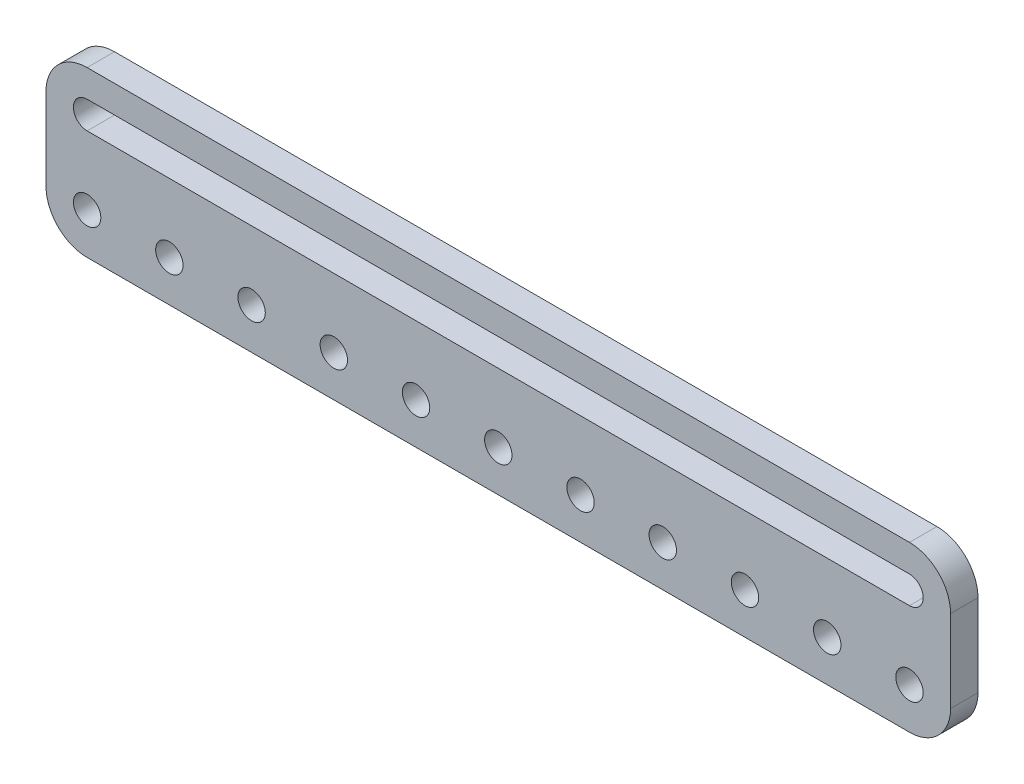
ISO-10303-21;
HEADER;
FILE_DESCRIPTION(('STEP AP214'),'2;1');
FILE_NAME('part.step','',(''),(''),'','','');
FILE_SCHEMA(('AUTOMOTIVE_DESIGN { 1 0 10303 214 1 1 1 1 }'));
ENDSEC;
DATA;
#1=APPLICATION_CONTEXT('core data for automotive mechanical design processes');
#2=APPLICATION_PROTOCOL_DEFINITION('international standard','automotive_design',2000,#1);
#3=PRODUCT_CONTEXT('',#1,'mechanical');
#4=PRODUCT('Part','Part','',(#3));
#5=PRODUCT_RELATED_PRODUCT_CATEGORY('part','',(#4));
#6=PRODUCT_DEFINITION_FORMATION('','',#4);
#7=PRODUCT_DEFINITION_CONTEXT('part definition',#1,'design');
#8=PRODUCT_DEFINITION('design','',#6,#7);
#9=PRODUCT_DEFINITION_SHAPE('','',#8);
#10=(LENGTH_UNIT() NAMED_UNIT(*) SI_UNIT(.MILLI.,.METRE.));
#11=(NAMED_UNIT(*) PLANE_ANGLE_UNIT() SI_UNIT($,.RADIAN.));
#12=(NAMED_UNIT(*) SI_UNIT($,.STERADIAN.) SOLID_ANGLE_UNIT());
#13=UNCERTAINTY_MEASURE_WITH_UNIT(LENGTH_MEASURE(1.E-05),#10,'distance_accuracy_value','');
#14=(GEOMETRIC_REPRESENTATION_CONTEXT(3) GLOBAL_UNCERTAINTY_ASSIGNED_CONTEXT((#13)) GLOBAL_UNIT_ASSIGNED_CONTEXT((#10,
#11,#12)) REPRESENTATION_CONTEXT('',''));
#15=CARTESIAN_POINT('',(0.,0.,0.));
#16=DIRECTION('',(0.,0.,1.));
#17=DIRECTION('',(1.,0.,0.));
#18=AXIS2_PLACEMENT_3D('',#15,#16,#17);
#19=CARTESIAN_POINT('',(346.4291313108,224.2422436139,3.));
#20=DIRECTION('',(0.,0.,1.));
#21=DIRECTION('',(1.,0.,0.));
#22=AXIS2_PLACEMENT_3D('',#19,#20,#21);
#23=PLANE('',#22);
#24=CARTESIAN_POINT('',(346.4291313108,215.2422436139,3.));
#25=DIRECTION('',(0.,0.,1.));
#26=DIRECTION('',(1.,0.,0.));
#27=AXIS2_PLACEMENT_3D('',#24,#25,#26);
#28=CIRCLE('',#27,1.5);
#29=CARTESIAN_POINT('',(347.9291313108,215.2422436139,3.));
#30=VERTEX_POINT('',#29);
#31=EDGE_CURVE('E158',#30,#30,#28,.T.);
#32=ORIENTED_EDGE('',*,*,#31,.F.);
#33=EDGE_LOOP('',(#32));
#34=FACE_BOUND('',#33,.T.);
#35=CARTESIAN_POINT('',(265.4291313108,215.2422436139,3.));
#36=DIRECTION('',(0.,0.,1.));
#37=DIRECTION('',(1.,0.,0.));
#38=AXIS2_PLACEMENT_3D('',#35,#36,#37);
#39=CIRCLE('',#38,1.5);
#40=CARTESIAN_POINT('',(266.9291313108,215.2422436139,3.));
#41=VERTEX_POINT('',#40);
#42=EDGE_CURVE('E170',#41,#41,#39,.T.);
#43=ORIENTED_EDGE('',*,*,#42,.F.);
#44=EDGE_LOOP('',(#43));
#45=FACE_BOUND('',#44,.T.);
#46=CARTESIAN_POINT('',(274.4291313108,215.2422436139,3.));
#47=DIRECTION('',(0.,0.,1.));
#48=DIRECTION('',(1.,0.,0.));
#49=AXIS2_PLACEMENT_3D('',#46,#47,#48);
#50=CIRCLE('',#49,1.5);
#51=CARTESIAN_POINT('',(275.9291313108,215.2422436139,3.));
#52=VERTEX_POINT('',#51);
#53=EDGE_CURVE('E182',#52,#52,#50,.T.);
#54=ORIENTED_EDGE('',*,*,#53,.F.);
#55=EDGE_LOOP('',(#54));
#56=FACE_BOUND('',#55,.T.);
#57=CARTESIAN_POINT('',(292.4291313108,215.2422436139,3.));
#58=DIRECTION('',(0.,0.,1.));
#59=DIRECTION('',(1.,0.,0.));
#60=AXIS2_PLACEMENT_3D('',#57,#58,#59);
#61=CIRCLE('',#60,1.5);
#62=CARTESIAN_POINT('',(293.9291313108,215.2422436139,3.));
#63=VERTEX_POINT('',#62);
#64=EDGE_CURVE('E194',#63,#63,#61,.T.);
#65=ORIENTED_EDGE('',*,*,#64,.F.);
#66=EDGE_LOOP('',(#65));
#67=FACE_BOUND('',#66,.T.);
#68=CARTESIAN_POINT('',(328.4291313108,215.2422436139,3.));
#69=DIRECTION('',(0.,0.,1.));
#70=DIRECTION('',(1.,0.,0.));
#71=AXIS2_PLACEMENT_3D('',#68,#69,#70);
#72=CIRCLE('',#71,1.5);
#73=CARTESIAN_POINT('',(329.9291313108,215.2422436139,3.));
#74=VERTEX_POINT('',#73);
#75=EDGE_CURVE('E206',#74,#74,#72,.T.);
#76=ORIENTED_EDGE('',*,*,#75,.F.);
#77=EDGE_LOOP('',(#76));
#78=FACE_BOUND('',#77,.T.);
#79=CARTESIAN_POINT('',(337.4291313108,215.2422436139,3.));
#80=DIRECTION('',(0.,0.,1.));
#81=DIRECTION('',(1.,0.,0.));
#82=AXIS2_PLACEMENT_3D('',#79,#80,#81);
#83=CIRCLE('',#82,1.5);
#84=CARTESIAN_POINT('',(338.9291313108,215.2422436139,3.));
#85=VERTEX_POINT('',#84);
#86=EDGE_CURVE('E218',#85,#85,#83,.T.);
#87=ORIENTED_EDGE('',*,*,#86,.F.);
#88=EDGE_LOOP('',(#87));
#89=FACE_BOUND('',#88,.T.);
#90=CARTESIAN_POINT('',(346.4291313108,224.2422436139,3.));
#91=DIRECTION('',(0.,0.,1.));
#92=DIRECTION('',(1.,0.,0.));
#93=AXIS2_PLACEMENT_3D('',#90,#91,#92);
#94=CIRCLE('',#93,4.5);
#95=CARTESIAN_POINT('',(350.9291313108,224.2422436139,3.));
#96=VERTEX_POINT('',#95);
#97=CARTESIAN_POINT('',(346.4291313108,228.7422436139,3.));
#98=VERTEX_POINT('',#97);
#99=EDGE_CURVE('E224',#96,#98,#94,.T.);
#100=ORIENTED_EDGE('',*,*,#99,.T.);
#101=DIRECTION('',(-1.,0.,0.));
#102=VECTOR('',#101,1.);
#103=CARTESIAN_POINT('',(256.4291313108,228.7422436139,3.));
#104=LINE('',#103,#102);
#105=CARTESIAN_POINT('',(256.4291313108,228.7422436139,3.));
#106=VERTEX_POINT('',#105);
#107=EDGE_CURVE('E227',#98,#106,#104,.T.);
#108=ORIENTED_EDGE('',*,*,#107,.T.);
#109=CARTESIAN_POINT('',(256.4291313108,224.2422436139,3.));
#110=DIRECTION('',(0.,0.,1.));
#111=DIRECTION('',(1.,0.,0.));
#112=AXIS2_PLACEMENT_3D('',#109,#110,#111);
#113=CIRCLE('',#112,4.5);
#114=CARTESIAN_POINT('',(251.9291313108,224.2422436139,3.));
#115=VERTEX_POINT('',#114);
#116=EDGE_CURVE('E230',#106,#115,#113,.T.);
#117=ORIENTED_EDGE('',*,*,#116,.T.);
#118=DIRECTION('',(0.,-1.,0.));
#119=VECTOR('',#118,1.);
#120=CARTESIAN_POINT('',(251.9291313108,224.2422436139,3.));
#121=LINE('',#120,#119);
#122=CARTESIAN_POINT('',(251.9291313108,215.2422436139,3.));
#123=VERTEX_POINT('',#122);
#124=EDGE_CURVE('E232',#115,#123,#121,.T.);
#125=ORIENTED_EDGE('',*,*,#124,.T.);
#126=CARTESIAN_POINT('',(256.4291313108,215.2422436139,3.));
#127=DIRECTION('',(0.,0.,1.));
#128=DIRECTION('',(1.,0.,0.));
#129=AXIS2_PLACEMENT_3D('',#126,#127,#128);
#130=CIRCLE('',#129,4.50000000000023);
#131=CARTESIAN_POINT('',(256.4291313108,210.7422436139,3.));
#132=VERTEX_POINT('',#131);
#133=EDGE_CURVE('E234',#123,#132,#130,.T.);
#134=ORIENTED_EDGE('',*,*,#133,.T.);
#135=DIRECTION('',(1.,0.,0.));
#136=VECTOR('',#135,1.);
#137=CARTESIAN_POINT('',(346.4291313108,210.7422436139,3.));
#138=LINE('',#137,#136);
#139=CARTESIAN_POINT('',(346.4291313108,210.7422436139,3.));
#140=VERTEX_POINT('',#139);
#141=EDGE_CURVE('E236',#132,#140,#138,.T.);
#142=ORIENTED_EDGE('',*,*,#141,.T.);
#143=CARTESIAN_POINT('',(346.4291313108,215.2422436139,3.));
#144=DIRECTION('',(0.,0.,1.));
#145=DIRECTION('',(1.,0.,0.));
#146=AXIS2_PLACEMENT_3D('',#143,#144,#145);
#147=CIRCLE('',#146,4.5);
#148=CARTESIAN_POINT('',(350.9291313108,215.2422436139,3.));
#149=VERTEX_POINT('',#148);
#150=EDGE_CURVE('E238',#140,#149,#147,.T.);
#151=ORIENTED_EDGE('',*,*,#150,.T.);
#152=DIRECTION('',(0.,1.,0.));
#153=VECTOR('',#152,1.);
#154=CARTESIAN_POINT('',(350.9291313108,224.2422436139,3.));
#155=LINE('',#154,#153);
#156=EDGE_CURVE('E240',#149,#96,#155,.T.);
#157=ORIENTED_EDGE('',*,*,#156,.T.);
#158=EDGE_LOOP('',(#100,#108,#117,#125,#134,#142,#151,#157));
#159=FACE_BOUND('',#158,.T.);
#160=CARTESIAN_POINT('',(319.4291313108,215.2422436139,3.));
#161=DIRECTION('',(0.,0.,1.));
#162=DIRECTION('',(1.,0.,0.));
#163=AXIS2_PLACEMENT_3D('',#160,#161,#162);
#164=CIRCLE('',#163,1.5);
#165=CARTESIAN_POINT('',(320.9291313108,215.2422436139,3.));
#166=VERTEX_POINT('',#165);
#167=EDGE_CURVE('E212',#166,#166,#164,.T.);
#168=ORIENTED_EDGE('',*,*,#167,.F.);
#169=EDGE_LOOP('',(#168));
#170=FACE_BOUND('',#169,.T.);
#171=CARTESIAN_POINT('',(310.4291313108,215.2422436139,3.));
#172=DIRECTION('',(0.,0.,1.));
#173=DIRECTION('',(1.,0.,0.));
#174=AXIS2_PLACEMENT_3D('',#171,#172,#173);
#175=CIRCLE('',#174,1.5);
#176=CARTESIAN_POINT('',(311.9291313108,215.2422436139,3.));
#177=VERTEX_POINT('',#176);
#178=EDGE_CURVE('E200',#177,#177,#175,.T.);
#179=ORIENTED_EDGE('',*,*,#178,.F.);
#180=EDGE_LOOP('',(#179));
#181=FACE_BOUND('',#180,.T.);
#182=CARTESIAN_POINT('',(301.4291313108,215.2422436139,3.));
#183=DIRECTION('',(0.,0.,1.));
#184=DIRECTION('',(1.,0.,0.));
#185=AXIS2_PLACEMENT_3D('',#182,#183,#184);
#186=CIRCLE('',#185,1.5);
#187=CARTESIAN_POINT('',(302.9291313108,215.2422436139,3.));
#188=VERTEX_POINT('',#187);
#189=EDGE_CURVE('E188',#188,#188,#186,.T.);
#190=ORIENTED_EDGE('',*,*,#189,.F.);
#191=EDGE_LOOP('',(#190));
#192=FACE_BOUND('',#191,.T.);
#193=CARTESIAN_POINT('',(283.4291313108,215.2422436139,3.));
#194=DIRECTION('',(0.,0.,1.));
#195=DIRECTION('',(1.,0.,0.));
#196=AXIS2_PLACEMENT_3D('',#193,#194,#195);
#197=CIRCLE('',#196,1.5);
#198=CARTESIAN_POINT('',(284.9291313108,215.2422436139,3.));
#199=VERTEX_POINT('',#198);
#200=EDGE_CURVE('E176',#199,#199,#197,.T.);
#201=ORIENTED_EDGE('',*,*,#200,.F.);
#202=EDGE_LOOP('',(#201));
#203=FACE_BOUND('',#202,.T.);
#204=CARTESIAN_POINT('',(256.4291313108,215.2422436139,3.));
#205=DIRECTION('',(0.,0.,1.));
#206=DIRECTION('',(1.,0.,0.));
#207=AXIS2_PLACEMENT_3D('',#204,#205,#206);
#208=CIRCLE('',#207,1.49999999999983);
#209=CARTESIAN_POINT('',(257.9291313108,215.2422436139,3.));
#210=VERTEX_POINT('',#209);
#211=EDGE_CURVE('E164',#210,#210,#208,.T.);
#212=ORIENTED_EDGE('',*,*,#211,.F.);
#213=EDGE_LOOP('',(#212));
#214=FACE_BOUND('',#213,.T.);
#215=DIRECTION('',(1.,0.,0.));
#216=VECTOR('',#215,1.);
#217=CARTESIAN_POINT('',(256.4291313108,222.7422436139,3.));
#218=LINE('',#217,#216);
#219=CARTESIAN_POINT('',(256.4291313108,222.7422436139,3.));
#220=VERTEX_POINT('',#219);
#221=CARTESIAN_POINT('',(346.4291313108,222.7422436139,3.));
#222=VERTEX_POINT('',#221);
#223=EDGE_CURVE('E130',#220,#222,#218,.T.);
#224=ORIENTED_EDGE('',*,*,#223,.F.);
#225=CARTESIAN_POINT('',(256.4291313108,224.2422436139,3.));
#226=DIRECTION('',(0.,0.,1.));
#227=DIRECTION('',(1.,0.,0.));
#228=AXIS2_PLACEMENT_3D('',#225,#226,#227);
#229=CIRCLE('',#228,1.5);
#230=CARTESIAN_POINT('',(256.4291313108,225.7422436139,3.));
#231=VERTEX_POINT('',#230);
#232=EDGE_CURVE('E122',#231,#220,#229,.T.);
#233=ORIENTED_EDGE('',*,*,#232,.F.);
#234=DIRECTION('',(-1.,0.,0.));
#235=VECTOR('',#234,1.);
#236=CARTESIAN_POINT('',(256.4291313108,225.7422436139,3.));
#237=LINE('',#236,#235);
#238=CARTESIAN_POINT('',(346.4291313108,225.7422436139,3.));
#239=VERTEX_POINT('',#238);
#240=EDGE_CURVE('E144',#239,#231,#237,.T.);
#241=ORIENTED_EDGE('',*,*,#240,.F.);
#242=CARTESIAN_POINT('',(346.4291313108,224.2422436139,3.));
#243=DIRECTION('',(0.,0.,1.));
#244=DIRECTION('',(1.,0.,0.));
#245=AXIS2_PLACEMENT_3D('',#242,#243,#244);
#246=CIRCLE('',#245,1.5);
#247=EDGE_CURVE('E142',#222,#239,#246,.T.);
#248=ORIENTED_EDGE('',*,*,#247,.F.);
#249=EDGE_LOOP('',(#224,#233,#241,#248));
#250=FACE_BOUND('',#249,.T.);
#251=ADVANCED_FACE('F33',(#34,#45,#56,#67,#78,#89,#159,#170,#181,#192,#203,#214,#250),#23,.T.);
#252=CARTESIAN_POINT('',(346.4291313108,224.2422436139,0.));
#253=DIRECTION('',(0.,0.,1.));
#254=DIRECTION('',(1.,0.,0.));
#255=AXIS2_PLACEMENT_3D('',#252,#253,#254);
#256=PLANE('',#255);
#257=CARTESIAN_POINT('',(346.4291313108,215.2422436139,0.));
#258=DIRECTION('',(0.,0.,1.));
#259=DIRECTION('',(1.,0.,0.));
#260=AXIS2_PLACEMENT_3D('',#257,#258,#259);
#261=CIRCLE('',#260,1.5);
#262=CARTESIAN_POINT('',(347.9291313108,215.2422436139,0.));
#263=VERTEX_POINT('',#262);
#264=EDGE_CURVE('E138',#263,#263,#261,.T.);
#265=ORIENTED_EDGE('',*,*,#264,.T.);
#266=EDGE_LOOP('',(#265));
#267=FACE_BOUND('',#266,.T.);
#268=CARTESIAN_POINT('',(265.4291313108,215.2422436139,0.));
#269=DIRECTION('',(0.,0.,1.));
#270=DIRECTION('',(1.,0.,0.));
#271=AXIS2_PLACEMENT_3D('',#268,#269,#270);
#272=CIRCLE('',#271,1.5);
#273=CARTESIAN_POINT('',(266.9291313108,215.2422436139,0.));
#274=VERTEX_POINT('',#273);
#275=EDGE_CURVE('E167',#274,#274,#272,.T.);
#276=ORIENTED_EDGE('',*,*,#275,.T.);
#277=EDGE_LOOP('',(#276));
#278=FACE_BOUND('',#277,.T.);
#279=CARTESIAN_POINT('',(274.4291313108,215.2422436139,0.));
#280=DIRECTION('',(0.,0.,1.));
#281=DIRECTION('',(1.,0.,0.));
#282=AXIS2_PLACEMENT_3D('',#279,#280,#281);
#283=CIRCLE('',#282,1.5);
#284=CARTESIAN_POINT('',(275.9291313108,215.2422436139,0.));
#285=VERTEX_POINT('',#284);
#286=EDGE_CURVE('E179',#285,#285,#283,.T.);
#287=ORIENTED_EDGE('',*,*,#286,.T.);
#288=EDGE_LOOP('',(#287));
#289=FACE_BOUND('',#288,.T.);
#290=CARTESIAN_POINT('',(292.4291313108,215.2422436139,0.));
#291=DIRECTION('',(0.,0.,1.));
#292=DIRECTION('',(1.,0.,0.));
#293=AXIS2_PLACEMENT_3D('',#290,#291,#292);
#294=CIRCLE('',#293,1.5);
#295=CARTESIAN_POINT('',(293.9291313108,215.2422436139,0.));
#296=VERTEX_POINT('',#295);
#297=EDGE_CURVE('E191',#296,#296,#294,.T.);
#298=ORIENTED_EDGE('',*,*,#297,.T.);
#299=EDGE_LOOP('',(#298));
#300=FACE_BOUND('',#299,.T.);
#301=CARTESIAN_POINT('',(328.4291313108,215.2422436139,0.));
#302=DIRECTION('',(0.,0.,1.));
#303=DIRECTION('',(1.,0.,0.));
#304=AXIS2_PLACEMENT_3D('',#301,#302,#303);
#305=CIRCLE('',#304,1.5);
#306=CARTESIAN_POINT('',(329.9291313108,215.2422436139,0.));
#307=VERTEX_POINT('',#306);
#308=EDGE_CURVE('E203',#307,#307,#305,.T.);
#309=ORIENTED_EDGE('',*,*,#308,.T.);
#310=EDGE_LOOP('',(#309));
#311=FACE_BOUND('',#310,.T.);
#312=CARTESIAN_POINT('',(337.4291313108,215.2422436139,0.));
#313=DIRECTION('',(0.,0.,1.));
#314=DIRECTION('',(1.,0.,0.));
#315=AXIS2_PLACEMENT_3D('',#312,#313,#314);
#316=CIRCLE('',#315,1.5);
#317=CARTESIAN_POINT('',(338.9291313108,215.2422436139,0.));
#318=VERTEX_POINT('',#317);
#319=EDGE_CURVE('E215',#318,#318,#316,.T.);
#320=ORIENTED_EDGE('',*,*,#319,.T.);
#321=EDGE_LOOP('',(#320));
#322=FACE_BOUND('',#321,.T.);
#323=CARTESIAN_POINT('',(346.4291313108,224.2422436139,0.));
#324=DIRECTION('',(0.,0.,1.));
#325=DIRECTION('',(1.,0.,0.));
#326=AXIS2_PLACEMENT_3D('',#323,#324,#325);
#327=CIRCLE('',#326,4.5);
#328=CARTESIAN_POINT('',(350.9291313108,224.2422436139,0.));
#329=VERTEX_POINT('',#328);
#330=CARTESIAN_POINT('',(346.4291313108,228.7422436139,0.));
#331=VERTEX_POINT('',#330);
#332=EDGE_CURVE('E221',#329,#331,#327,.T.);
#333=ORIENTED_EDGE('',*,*,#332,.F.);
#334=DIRECTION('',(0.,1.,0.));
#335=VECTOR('',#334,1.);
#336=CARTESIAN_POINT('',(350.9291313108,224.2422436139,0.));
#337=LINE('',#336,#335);
#338=CARTESIAN_POINT('',(350.9291313108,215.2422436139,0.));
#339=VERTEX_POINT('',#338);
#340=EDGE_CURVE('E228',#339,#329,#337,.T.);
#341=ORIENTED_EDGE('',*,*,#340,.F.);
#342=CARTESIAN_POINT('',(346.4291313108,215.2422436139,0.));
#343=DIRECTION('',(0.,0.,1.));
#344=DIRECTION('',(1.,0.,0.));
#345=AXIS2_PLACEMENT_3D('',#342,#343,#344);
#346=CIRCLE('',#345,4.5);
#347=CARTESIAN_POINT('',(346.4291313108,210.7422436139,0.));
#348=VERTEX_POINT('',#347);
#349=EDGE_CURVE('E255',#348,#339,#346,.T.);
#350=ORIENTED_EDGE('',*,*,#349,.F.);
#351=DIRECTION('',(1.,0.,0.));
#352=VECTOR('',#351,1.);
#353=CARTESIAN_POINT('',(346.4291313108,210.7422436139,0.));
#354=LINE('',#353,#352);
#355=CARTESIAN_POINT('',(256.4291313108,210.7422436139,0.));
#356=VERTEX_POINT('',#355);
#357=EDGE_CURVE('E253',#356,#348,#354,.T.);
#358=ORIENTED_EDGE('',*,*,#357,.F.);
#359=CARTESIAN_POINT('',(256.4291313108,215.2422436139,0.));
#360=DIRECTION('',(0.,0.,1.));
#361=DIRECTION('',(1.,0.,0.));
#362=AXIS2_PLACEMENT_3D('',#359,#360,#361);
#363=CIRCLE('',#362,4.50000000000023);
#364=CARTESIAN_POINT('',(251.9291313108,215.2422436139,0.));
#365=VERTEX_POINT('',#364);
#366=EDGE_CURVE('E251',#365,#356,#363,.T.);
#367=ORIENTED_EDGE('',*,*,#366,.F.);
#368=DIRECTION('',(0.,-1.,0.));
#369=VECTOR('',#368,1.);
#370=CARTESIAN_POINT('',(251.9291313108,224.2422436139,0.));
#371=LINE('',#370,#369);
#372=CARTESIAN_POINT('',(251.9291313108,224.2422436139,0.));
#373=VERTEX_POINT('',#372);
#374=EDGE_CURVE('E249',#373,#365,#371,.T.);
#375=ORIENTED_EDGE('',*,*,#374,.F.);
#376=CARTESIAN_POINT('',(256.4291313108,224.2422436139,0.));
#377=DIRECTION('',(0.,0.,1.));
#378=DIRECTION('',(1.,0.,0.));
#379=AXIS2_PLACEMENT_3D('',#376,#377,#378);
#380=CIRCLE('',#379,4.5);
#381=CARTESIAN_POINT('',(256.4291313108,228.7422436139,0.));
#382=VERTEX_POINT('',#381);
#383=EDGE_CURVE('E247',#382,#373,#380,.T.);
#384=ORIENTED_EDGE('',*,*,#383,.F.);
#385=DIRECTION('',(-1.,0.,0.));
#386=VECTOR('',#385,1.);
#387=CARTESIAN_POINT('',(256.4291313108,228.7422436139,0.));
#388=LINE('',#387,#386);
#389=EDGE_CURVE('E245',#331,#382,#388,.T.);
#390=ORIENTED_EDGE('',*,*,#389,.F.);
#391=EDGE_LOOP('',(#333,#341,#350,#358,#367,#375,#384,#390));
#392=FACE_BOUND('',#391,.T.);
#393=CARTESIAN_POINT('',(319.4291313108,215.2422436139,0.));
#394=DIRECTION('',(0.,0.,1.));
#395=DIRECTION('',(1.,0.,0.));
#396=AXIS2_PLACEMENT_3D('',#393,#394,#395);
#397=CIRCLE('',#396,1.5);
#398=CARTESIAN_POINT('',(320.9291313108,215.2422436139,0.));
#399=VERTEX_POINT('',#398);
#400=EDGE_CURVE('E209',#399,#399,#397,.T.);
#401=ORIENTED_EDGE('',*,*,#400,.T.);
#402=EDGE_LOOP('',(#401));
#403=FACE_BOUND('',#402,.T.);
#404=CARTESIAN_POINT('',(310.4291313108,215.2422436139,0.));
#405=DIRECTION('',(0.,0.,1.));
#406=DIRECTION('',(1.,0.,0.));
#407=AXIS2_PLACEMENT_3D('',#404,#405,#406);
#408=CIRCLE('',#407,1.5);
#409=CARTESIAN_POINT('',(311.9291313108,215.2422436139,0.));
#410=VERTEX_POINT('',#409);
#411=EDGE_CURVE('E197',#410,#410,#408,.T.);
#412=ORIENTED_EDGE('',*,*,#411,.T.);
#413=EDGE_LOOP('',(#412));
#414=FACE_BOUND('',#413,.T.);
#415=CARTESIAN_POINT('',(301.4291313108,215.2422436139,0.));
#416=DIRECTION('',(0.,0.,1.));
#417=DIRECTION('',(1.,0.,0.));
#418=AXIS2_PLACEMENT_3D('',#415,#416,#417);
#419=CIRCLE('',#418,1.5);
#420=CARTESIAN_POINT('',(302.9291313108,215.2422436139,0.));
#421=VERTEX_POINT('',#420);
#422=EDGE_CURVE('E185',#421,#421,#419,.T.);
#423=ORIENTED_EDGE('',*,*,#422,.T.);
#424=EDGE_LOOP('',(#423));
#425=FACE_BOUND('',#424,.T.);
#426=CARTESIAN_POINT('',(283.4291313108,215.2422436139,0.));
#427=DIRECTION('',(0.,0.,1.));
#428=DIRECTION('',(1.,0.,0.));
#429=AXIS2_PLACEMENT_3D('',#426,#427,#428);
#430=CIRCLE('',#429,1.5);
#431=CARTESIAN_POINT('',(284.9291313108,215.2422436139,0.));
#432=VERTEX_POINT('',#431);
#433=EDGE_CURVE('E173',#432,#432,#430,.T.);
#434=ORIENTED_EDGE('',*,*,#433,.T.);
#435=EDGE_LOOP('',(#434));
#436=FACE_BOUND('',#435,.T.);
#437=CARTESIAN_POINT('',(256.4291313108,215.2422436139,0.));
#438=DIRECTION('',(0.,0.,1.));
#439=DIRECTION('',(1.,0.,0.));
#440=AXIS2_PLACEMENT_3D('',#437,#438,#439);
#441=CIRCLE('',#440,1.49999999999983);
#442=CARTESIAN_POINT('',(257.9291313108,215.2422436139,0.));
#443=VERTEX_POINT('',#442);
#444=EDGE_CURVE('E161',#443,#443,#441,.T.);
#445=ORIENTED_EDGE('',*,*,#444,.T.);
#446=EDGE_LOOP('',(#445));
#447=FACE_BOUND('',#446,.T.);
#448=CARTESIAN_POINT('',(256.4291313108,224.2422436139,0.));
#449=DIRECTION('',(0.,0.,1.));
#450=DIRECTION('',(1.,0.,0.));
#451=AXIS2_PLACEMENT_3D('',#448,#449,#450);
#452=CIRCLE('',#451,1.5);
#453=CARTESIAN_POINT('',(256.4291313108,225.7422436139,0.));
#454=VERTEX_POINT('',#453);
#455=CARTESIAN_POINT('',(256.4291313108,222.7422436139,0.));
#456=VERTEX_POINT('',#455);
#457=EDGE_CURVE('E56',#454,#456,#452,.T.);
#458=ORIENTED_EDGE('',*,*,#457,.T.);
#459=DIRECTION('',(1.,0.,0.));
#460=VECTOR('',#459,1.);
#461=CARTESIAN_POINT('',(256.4291313108,222.7422436139,0.));
#462=LINE('',#461,#460);
#463=CARTESIAN_POINT('',(346.4291313108,222.7422436139,0.));
#464=VERTEX_POINT('',#463);
#465=EDGE_CURVE('E137',#456,#464,#462,.T.);
#466=ORIENTED_EDGE('',*,*,#465,.T.);
#467=CARTESIAN_POINT('',(346.4291313108,224.2422436139,0.));
#468=DIRECTION('',(0.,0.,1.));
#469=DIRECTION('',(1.,0.,0.));
#470=AXIS2_PLACEMENT_3D('',#467,#468,#469);
#471=CIRCLE('',#470,1.5);
#472=CARTESIAN_POINT('',(346.4291313108,225.7422436139,0.));
#473=VERTEX_POINT('',#472);
#474=EDGE_CURVE('E150',#464,#473,#471,.T.);
#475=ORIENTED_EDGE('',*,*,#474,.T.);
#476=DIRECTION('',(-1.,0.,0.));
#477=VECTOR('',#476,1.);
#478=CARTESIAN_POINT('',(256.4291313108,225.7422436139,0.));
#479=LINE('',#478,#477);
#480=EDGE_CURVE('E131',#473,#454,#479,.T.);
#481=ORIENTED_EDGE('',*,*,#480,.T.);
#482=EDGE_LOOP('',(#458,#466,#475,#481));
#483=FACE_BOUND('',#482,.T.);
#484=ADVANCED_FACE('F285',(#267,#278,#289,#300,#311,#322,#392,#403,#414,#425,#436,#447,#483),
#256,.F.);
#485=CARTESIAN_POINT('',(346.4291313108,224.2422436139,3.));
#486=DIRECTION('',(0.,0.,-1.));
#487=DIRECTION('',(-1.,0.,0.));
#488=AXIS2_PLACEMENT_3D('',#485,#486,#487);
#489=CYLINDRICAL_SURFACE('',#488,4.5);
#490=ORIENTED_EDGE('',*,*,#332,.T.);
#491=DIRECTION('',(0.,0.,-1.));
#492=VECTOR('',#491,1.);
#493=CARTESIAN_POINT('',(346.4291313108,228.7422436139,3.));
#494=LINE('',#493,#492);
#495=EDGE_CURVE('E11',#98,#331,#494,.T.);
#496=ORIENTED_EDGE('',*,*,#495,.F.);
#497=ORIENTED_EDGE('',*,*,#99,.F.);
#498=DIRECTION('',(0.,0.,-1.));
#499=VECTOR('',#498,1.);
#500=CARTESIAN_POINT('',(350.9291313108,224.2422436139,3.));
#501=LINE('',#500,#499);
#502=EDGE_CURVE('E242',#96,#329,#501,.T.);
#503=ORIENTED_EDGE('',*,*,#502,.T.);
#504=EDGE_LOOP('',(#490,#496,#497,#503));
#505=FACE_BOUND('',#504,.T.);
#506=ADVANCED_FACE('F35',(#505),#489,.T.);
#507=CARTESIAN_POINT('',(256.4291313108,228.7422436139,3.));
#508=DIRECTION('',(0.,-1.,0.));
#509=DIRECTION('',(0.,0.,-1.));
#510=AXIS2_PLACEMENT_3D('',#507,#508,#509);
#511=PLANE('',#510);
#512=ORIENTED_EDGE('',*,*,#389,.T.);
#513=DIRECTION('',(0.,0.,-1.));
#514=VECTOR('',#513,1.);
#515=CARTESIAN_POINT('',(256.4291313108,228.7422436139,3.));
#516=LINE('',#515,#514);
#517=EDGE_CURVE('E41',#106,#382,#516,.T.);
#518=ORIENTED_EDGE('',*,*,#517,.F.);
#519=ORIENTED_EDGE('',*,*,#107,.F.);
#520=ORIENTED_EDGE('',*,*,#495,.T.);
#521=EDGE_LOOP('',(#512,#518,#519,#520));
#522=FACE_BOUND('',#521,.T.);
#523=ADVANCED_FACE('F303',(#522),#511,.F.);
#524=CARTESIAN_POINT('',(256.4291313108,224.2422436139,3.));
#525=DIRECTION('',(0.,0.,-1.));
#526=DIRECTION('',(-1.,0.,0.));
#527=AXIS2_PLACEMENT_3D('',#524,#525,#526);
#528=CYLINDRICAL_SURFACE('',#527,4.5);
#529=ORIENTED_EDGE('',*,*,#383,.T.);
#530=DIRECTION('',(0.,0.,-1.));
#531=VECTOR('',#530,1.);
#532=CARTESIAN_POINT('',(251.9291313108,224.2422436139,3.));
#533=LINE('',#532,#531);
#534=EDGE_CURVE('E272',#115,#373,#533,.T.);
#535=ORIENTED_EDGE('',*,*,#534,.F.);
#536=ORIENTED_EDGE('',*,*,#116,.F.);
#537=ORIENTED_EDGE('',*,*,#517,.T.);
#538=EDGE_LOOP('',(#529,#535,#536,#537));
#539=FACE_BOUND('',#538,.T.);
#540=ADVANCED_FACE('F279',(#539),#528,.T.);
#541=CARTESIAN_POINT('',(251.9291313108,224.2422436139,3.));
#542=DIRECTION('',(1.,0.,0.));
#543=DIRECTION('',(0.,0.,-1.));
#544=AXIS2_PLACEMENT_3D('',#541,#542,#543);
#545=PLANE('',#544);
#546=ORIENTED_EDGE('',*,*,#374,.T.);
#547=DIRECTION('',(0.,0.,-1.));
#548=VECTOR('',#547,1.);
#549=CARTESIAN_POINT('',(251.9291313108,215.2422436139,3.));
#550=LINE('',#549,#548);
#551=EDGE_CURVE('E269',#123,#365,#550,.T.);
#552=ORIENTED_EDGE('',*,*,#551,.F.);
#553=ORIENTED_EDGE('',*,*,#124,.F.);
#554=ORIENTED_EDGE('',*,*,#534,.T.);
#555=EDGE_LOOP('',(#546,#552,#553,#554));
#556=FACE_BOUND('',#555,.T.);
#557=ADVANCED_FACE('F291',(#556),#545,.F.);
#558=CARTESIAN_POINT('',(256.4291313108,215.2422436139,3.));
#559=DIRECTION('',(0.,0.,-1.));
#560=DIRECTION('',(-1.,0.,0.));
#561=AXIS2_PLACEMENT_3D('',#558,#559,#560);
#562=CYLINDRICAL_SURFACE('',#561,4.50000000000023);
#563=ORIENTED_EDGE('',*,*,#366,.T.);
#564=DIRECTION('',(0.,0.,-1.));
#565=VECTOR('',#564,1.);
#566=CARTESIAN_POINT('',(256.4291313108,210.7422436139,3.));
#567=LINE('',#566,#565);
#568=EDGE_CURVE('E266',#132,#356,#567,.T.);
#569=ORIENTED_EDGE('',*,*,#568,.F.);
#570=ORIENTED_EDGE('',*,*,#133,.F.);
#571=ORIENTED_EDGE('',*,*,#551,.T.);
#572=EDGE_LOOP('',(#563,#569,#570,#571));
#573=FACE_BOUND('',#572,.T.);
#574=ADVANCED_FACE('F295',(#573),#562,.T.);
#575=CARTESIAN_POINT('',(346.4291313108,210.7422436139,3.));
#576=DIRECTION('',(0.,1.,0.));
#577=DIRECTION('',(0.,0.,1.));
#578=AXIS2_PLACEMENT_3D('',#575,#576,#577);
#579=PLANE('',#578);
#580=ORIENTED_EDGE('',*,*,#357,.T.);
#581=DIRECTION('',(0.,0.,-1.));
#582=VECTOR('',#581,1.);
#583=CARTESIAN_POINT('',(346.4291313108,210.7422436139,3.));
#584=LINE('',#583,#582);
#585=EDGE_CURVE('E263',#140,#348,#584,.T.);
#586=ORIENTED_EDGE('',*,*,#585,.F.);
#587=ORIENTED_EDGE('',*,*,#141,.F.);
#588=ORIENTED_EDGE('',*,*,#568,.T.);
#589=EDGE_LOOP('',(#580,#586,#587,#588));
#590=FACE_BOUND('',#589,.T.);
#591=ADVANCED_FACE('F316',(#590),#579,.F.);
#592=CARTESIAN_POINT('',(346.4291313108,215.2422436139,3.));
#593=DIRECTION('',(0.,0.,-1.));
#594=DIRECTION('',(-1.,0.,0.));
#595=AXIS2_PLACEMENT_3D('',#592,#593,#594);
#596=CYLINDRICAL_SURFACE('',#595,4.5);
#597=ORIENTED_EDGE('',*,*,#349,.T.);
#598=DIRECTION('',(0.,0.,-1.));
#599=VECTOR('',#598,1.);
#600=CARTESIAN_POINT('',(350.9291313108,215.2422436139,3.));
#601=LINE('',#600,#599);
#602=EDGE_CURVE('E260',#149,#339,#601,.T.);
#603=ORIENTED_EDGE('',*,*,#602,.F.);
#604=ORIENTED_EDGE('',*,*,#150,.F.);
#605=ORIENTED_EDGE('',*,*,#585,.T.);
#606=EDGE_LOOP('',(#597,#603,#604,#605));
#607=FACE_BOUND('',#606,.T.);
#608=ADVANCED_FACE('F314',(#607),#596,.T.);
#609=CARTESIAN_POINT('',(350.9291313108,224.2422436139,3.));
#610=DIRECTION('',(-1.,0.,0.));
#611=DIRECTION('',(0.,0.,1.));
#612=AXIS2_PLACEMENT_3D('',#609,#610,#611);
#613=PLANE('',#612);
#614=ORIENTED_EDGE('',*,*,#340,.T.);
#615=ORIENTED_EDGE('',*,*,#502,.F.);
#616=ORIENTED_EDGE('',*,*,#156,.F.);
#617=ORIENTED_EDGE('',*,*,#602,.T.);
#618=EDGE_LOOP('',(#614,#615,#616,#617));
#619=FACE_BOUND('',#618,.T.);
#620=ADVANCED_FACE('F309',(#619),#613,.F.);
#621=CARTESIAN_POINT('',(337.4291313108,215.2422436139,3.));
#622=DIRECTION('',(0.,0.,-1.));
#623=DIRECTION('',(-1.,0.,0.));
#624=AXIS2_PLACEMENT_3D('',#621,#622,#623);
#625=CYLINDRICAL_SURFACE('',#624,1.5);
#626=ORIENTED_EDGE('',*,*,#86,.T.);
#627=EDGE_LOOP('',(#626));
#628=FACE_BOUND('',#627,.T.);
#629=ORIENTED_EDGE('',*,*,#319,.F.);
#630=EDGE_LOOP('',(#629));
#631=FACE_BOUND('',#630,.T.);
#632=ADVANCED_FACE('F336',(#628,#631),#625,.F.);
#633=CARTESIAN_POINT('',(319.4291313108,215.2422436139,3.));
#634=DIRECTION('',(0.,0.,-1.));
#635=DIRECTION('',(-1.,0.,0.));
#636=AXIS2_PLACEMENT_3D('',#633,#634,#635);
#637=CYLINDRICAL_SURFACE('',#636,1.5);
#638=ORIENTED_EDGE('',*,*,#167,.T.);
#639=EDGE_LOOP('',(#638));
#640=FACE_BOUND('',#639,.T.);
#641=ORIENTED_EDGE('',*,*,#400,.F.);
#642=EDGE_LOOP('',(#641));
#643=FACE_BOUND('',#642,.T.);
#644=ADVANCED_FACE('F343',(#640,#643),#637,.F.);
#645=CARTESIAN_POINT('',(328.4291313108,215.2422436139,3.));
#646=DIRECTION('',(0.,0.,-1.));
#647=DIRECTION('',(-1.,0.,0.));
#648=AXIS2_PLACEMENT_3D('',#645,#646,#647);
#649=CYLINDRICAL_SURFACE('',#648,1.5);
#650=ORIENTED_EDGE('',*,*,#75,.T.);
#651=EDGE_LOOP('',(#650));
#652=FACE_BOUND('',#651,.T.);
#653=ORIENTED_EDGE('',*,*,#308,.F.);
#654=EDGE_LOOP('',(#653));
#655=FACE_BOUND('',#654,.T.);
#656=ADVANCED_FACE('F348',(#652,#655),#649,.F.);
#657=CARTESIAN_POINT('',(310.4291313108,215.2422436139,3.));
#658=DIRECTION('',(0.,0.,-1.));
#659=DIRECTION('',(-1.,0.,0.));
#660=AXIS2_PLACEMENT_3D('',#657,#658,#659);
#661=CYLINDRICAL_SURFACE('',#660,1.5);
#662=ORIENTED_EDGE('',*,*,#178,.T.);
#663=EDGE_LOOP('',(#662));
#664=FACE_BOUND('',#663,.T.);
#665=ORIENTED_EDGE('',*,*,#411,.F.);
#666=EDGE_LOOP('',(#665));
#667=FACE_BOUND('',#666,.T.);
#668=ADVANCED_FACE('F358',(#664,#667),#661,.F.);
#669=CARTESIAN_POINT('',(292.4291313108,215.2422436139,3.));
#670=DIRECTION('',(0.,0.,-1.));
#671=DIRECTION('',(-1.,0.,0.));
#672=AXIS2_PLACEMENT_3D('',#669,#670,#671);
#673=CYLINDRICAL_SURFACE('',#672,1.5);
#674=ORIENTED_EDGE('',*,*,#64,.T.);
#675=EDGE_LOOP('',(#674));
#676=FACE_BOUND('',#675,.T.);
#677=ORIENTED_EDGE('',*,*,#297,.F.);
#678=EDGE_LOOP('',(#677));
#679=FACE_BOUND('',#678,.T.);
#680=ADVANCED_FACE('F365',(#676,#679),#673,.F.);
#681=CARTESIAN_POINT('',(301.4291313108,215.2422436139,3.));
#682=DIRECTION('',(0.,0.,-1.));
#683=DIRECTION('',(-1.,0.,0.));
#684=AXIS2_PLACEMENT_3D('',#681,#682,#683);
#685=CYLINDRICAL_SURFACE('',#684,1.5);
#686=ORIENTED_EDGE('',*,*,#189,.T.);
#687=EDGE_LOOP('',(#686));
#688=FACE_BOUND('',#687,.T.);
#689=ORIENTED_EDGE('',*,*,#422,.F.);
#690=EDGE_LOOP('',(#689));
#691=FACE_BOUND('',#690,.T.);
#692=ADVANCED_FACE('F369',(#688,#691),#685,.F.);
#693=CARTESIAN_POINT('',(274.4291313108,215.2422436139,3.));
#694=DIRECTION('',(0.,0.,-1.));
#695=DIRECTION('',(-1.,0.,0.));
#696=AXIS2_PLACEMENT_3D('',#693,#694,#695);
#697=CYLINDRICAL_SURFACE('',#696,1.5);
#698=ORIENTED_EDGE('',*,*,#53,.T.);
#699=EDGE_LOOP('',(#698));
#700=FACE_BOUND('',#699,.T.);
#701=ORIENTED_EDGE('',*,*,#286,.F.);
#702=EDGE_LOOP('',(#701));
#703=FACE_BOUND('',#702,.T.);
#704=ADVANCED_FACE('F373',(#700,#703),#697,.F.);
#705=CARTESIAN_POINT('',(283.4291313108,215.2422436139,3.));
#706=DIRECTION('',(0.,0.,-1.));
#707=DIRECTION('',(-1.,0.,0.));
#708=AXIS2_PLACEMENT_3D('',#705,#706,#707);
#709=CYLINDRICAL_SURFACE('',#708,1.5);
#710=ORIENTED_EDGE('',*,*,#200,.T.);
#711=EDGE_LOOP('',(#710));
#712=FACE_BOUND('',#711,.T.);
#713=ORIENTED_EDGE('',*,*,#433,.F.);
#714=EDGE_LOOP('',(#713));
#715=FACE_BOUND('',#714,.T.);
#716=ADVANCED_FACE('F377',(#712,#715),#709,.F.);
#717=CARTESIAN_POINT('',(265.4291313108,215.2422436139,3.));
#718=DIRECTION('',(0.,0.,-1.));
#719=DIRECTION('',(-1.,0.,0.));
#720=AXIS2_PLACEMENT_3D('',#717,#718,#719);
#721=CYLINDRICAL_SURFACE('',#720,1.5);
#722=ORIENTED_EDGE('',*,*,#42,.T.);
#723=EDGE_LOOP('',(#722));
#724=FACE_BOUND('',#723,.T.);
#725=ORIENTED_EDGE('',*,*,#275,.F.);
#726=EDGE_LOOP('',(#725));
#727=FACE_BOUND('',#726,.T.);
#728=ADVANCED_FACE('F381',(#724,#727),#721,.F.);
#729=CARTESIAN_POINT('',(256.4291313108,215.2422436139,3.));
#730=DIRECTION('',(0.,0.,-1.));
#731=DIRECTION('',(-1.,0.,0.));
#732=AXIS2_PLACEMENT_3D('',#729,#730,#731);
#733=CYLINDRICAL_SURFACE('',#732,1.49999999999983);
#734=ORIENTED_EDGE('',*,*,#211,.T.);
#735=EDGE_LOOP('',(#734));
#736=FACE_BOUND('',#735,.T.);
#737=ORIENTED_EDGE('',*,*,#444,.F.);
#738=EDGE_LOOP('',(#737));
#739=FACE_BOUND('',#738,.T.);
#740=ADVANCED_FACE('F385',(#736,#739),#733,.F.);
#741=CARTESIAN_POINT('',(346.4291313108,215.2422436139,3.));
#742=DIRECTION('',(0.,0.,-1.));
#743=DIRECTION('',(-1.,0.,0.));
#744=AXIS2_PLACEMENT_3D('',#741,#742,#743);
#745=CYLINDRICAL_SURFACE('',#744,1.5);
#746=ORIENTED_EDGE('',*,*,#31,.T.);
#747=EDGE_LOOP('',(#746));
#748=FACE_BOUND('',#747,.T.);
#749=ORIENTED_EDGE('',*,*,#264,.F.);
#750=EDGE_LOOP('',(#749));
#751=FACE_BOUND('',#750,.T.);
#752=ADVANCED_FACE('F389',(#748,#751),#745,.F.);
#753=CARTESIAN_POINT('',(256.4291313108,224.2422436139,3.));
#754=DIRECTION('',(0.,0.,-1.));
#755=DIRECTION('',(-1.,0.,0.));
#756=AXIS2_PLACEMENT_3D('',#753,#754,#755);
#757=CYLINDRICAL_SURFACE('',#756,1.5);
#758=ORIENTED_EDGE('',*,*,#457,.F.);
#759=DIRECTION('',(0.,0.,-1.));
#760=VECTOR('',#759,1.);
#761=CARTESIAN_POINT('',(256.4291313108,225.7422436139,3.));
#762=LINE('',#761,#760);
#763=EDGE_CURVE('E126',#231,#454,#762,.T.);
#764=ORIENTED_EDGE('',*,*,#763,.F.);
#765=ORIENTED_EDGE('',*,*,#232,.T.);
#766=DIRECTION('',(0.,0.,-1.));
#767=VECTOR('',#766,1.);
#768=CARTESIAN_POINT('',(256.4291313108,222.7422436139,3.));
#769=LINE('',#768,#767);
#770=EDGE_CURVE('E125',#220,#456,#769,.T.);
#771=ORIENTED_EDGE('',*,*,#770,.T.);
#772=EDGE_LOOP('',(#758,#764,#765,#771));
#773=FACE_BOUND('',#772,.T.);
#774=ADVANCED_FACE('F124',(#773),#757,.F.);
#775=CARTESIAN_POINT('',(256.4291313108,222.7422436139,3.));
#776=DIRECTION('',(0.,1.,0.));
#777=DIRECTION('',(0.,0.,1.));
#778=AXIS2_PLACEMENT_3D('',#775,#776,#777);
#779=PLANE('',#778);
#780=ORIENTED_EDGE('',*,*,#465,.F.);
#781=ORIENTED_EDGE('',*,*,#770,.F.);
#782=ORIENTED_EDGE('',*,*,#223,.T.);
#783=DIRECTION('',(0.,0.,-1.));
#784=VECTOR('',#783,1.);
#785=CARTESIAN_POINT('',(346.4291313108,222.7422436139,3.));
#786=LINE('',#785,#784);
#787=EDGE_CURVE('E139',#222,#464,#786,.T.);
#788=ORIENTED_EDGE('',*,*,#787,.T.);
#789=EDGE_LOOP('',(#780,#781,#782,#788));
#790=FACE_BOUND('',#789,.T.);
#791=ADVANCED_FACE('F134',(#790),#779,.T.);
#792=CARTESIAN_POINT('',(346.4291313108,224.2422436139,3.));
#793=DIRECTION('',(0.,0.,-1.));
#794=DIRECTION('',(-1.,0.,0.));
#795=AXIS2_PLACEMENT_3D('',#792,#793,#794);
#796=CYLINDRICAL_SURFACE('',#795,1.5);
#797=ORIENTED_EDGE('',*,*,#474,.F.);
#798=ORIENTED_EDGE('',*,*,#787,.F.);
#799=ORIENTED_EDGE('',*,*,#247,.T.);
#800=DIRECTION('',(0.,0.,-1.));
#801=VECTOR('',#800,1.);
#802=CARTESIAN_POINT('',(346.4291313108,225.7422436139,3.));
#803=LINE('',#802,#801);
#804=EDGE_CURVE('E48',#239,#473,#803,.T.);
#805=ORIENTED_EDGE('',*,*,#804,.T.);
#806=EDGE_LOOP('',(#797,#798,#799,#805));
#807=FACE_BOUND('',#806,.T.);
#808=ADVANCED_FACE('F398',(#807),#796,.F.);
#809=CARTESIAN_POINT('',(256.4291313108,225.7422436139,3.));
#810=DIRECTION('',(0.,-1.,0.));
#811=DIRECTION('',(0.,0.,-1.));
#812=AXIS2_PLACEMENT_3D('',#809,#810,#811);
#813=PLANE('',#812);
#814=ORIENTED_EDGE('',*,*,#480,.F.);
#815=ORIENTED_EDGE('',*,*,#804,.F.);
#816=ORIENTED_EDGE('',*,*,#240,.T.);
#817=ORIENTED_EDGE('',*,*,#763,.T.);
#818=EDGE_LOOP('',(#814,#815,#816,#817));
#819=FACE_BOUND('',#818,.T.);
#820=ADVANCED_FACE('F401',(#819),#813,.T.);
#821=CLOSED_SHELL('',(#251,#484,#506,#523,#540,#557,#574,#591,#608,#620,#632,#644,#656,#668,
#680,#692,#704,#716,#728,#740,#752,#774,#791,#808,#820));
#822=MANIFOLD_SOLID_BREP('B2',#821);
#823=ADVANCED_BREP_SHAPE_REPRESENTATION('',(#18,#822),#14);
#824=SHAPE_DEFINITION_REPRESENTATION(#9,#823);
ENDSEC;
END-ISO-10303-21;
